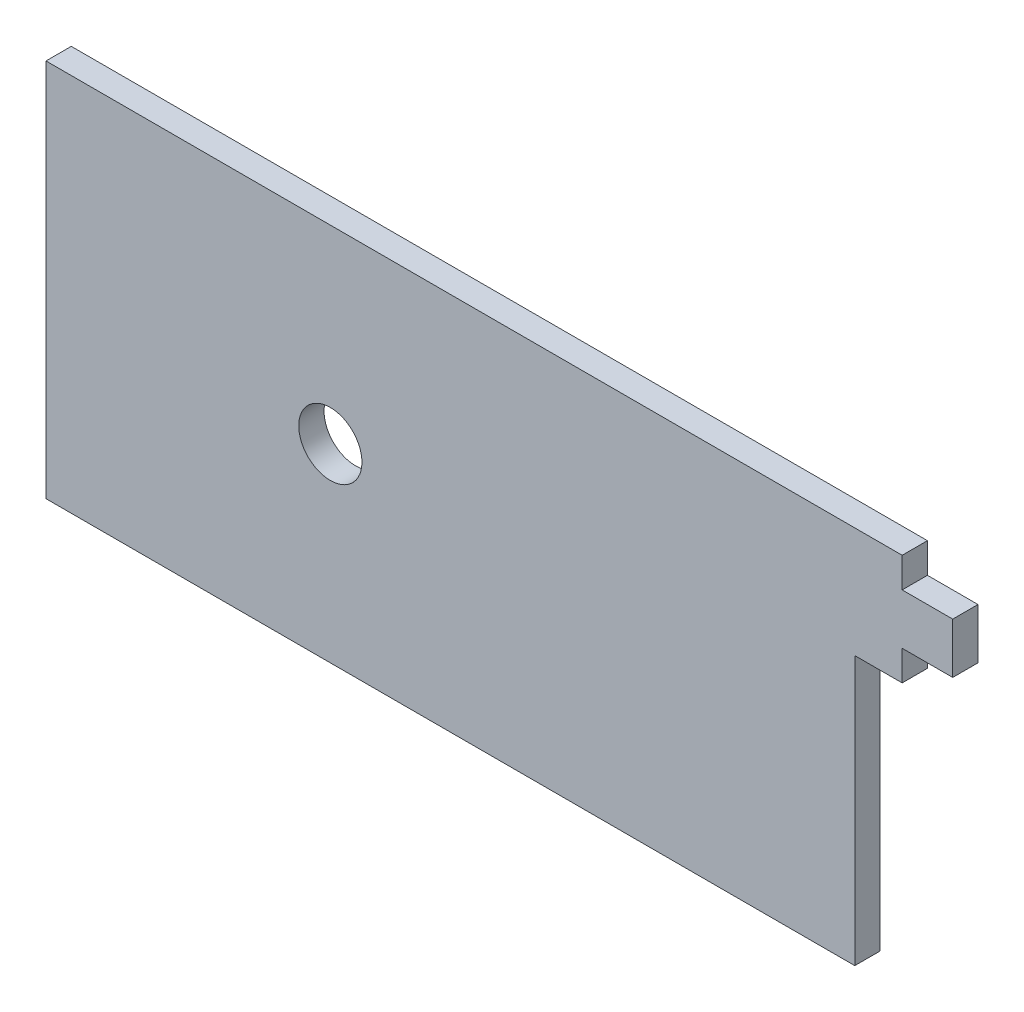
ISO-10303-21;
HEADER;
FILE_DESCRIPTION(('STEP AP214'),'2;1');
FILE_NAME('part.step','',(''),(''),'','','');
FILE_SCHEMA(('AUTOMOTIVE_DESIGN { 1 0 10303 214 1 1 1 1 }'));
ENDSEC;
DATA;
#1=APPLICATION_CONTEXT('core data for automotive mechanical design processes');
#2=APPLICATION_PROTOCOL_DEFINITION('international standard','automotive_design',2000,#1);
#3=PRODUCT_CONTEXT('',#1,'mechanical');
#4=PRODUCT('Part','Part','',(#3));
#5=PRODUCT_RELATED_PRODUCT_CATEGORY('part','',(#4));
#6=PRODUCT_DEFINITION_FORMATION('','',#4);
#7=PRODUCT_DEFINITION_CONTEXT('part definition',#1,'design');
#8=PRODUCT_DEFINITION('design','',#6,#7);
#9=PRODUCT_DEFINITION_SHAPE('','',#8);
#10=(LENGTH_UNIT() NAMED_UNIT(*) SI_UNIT(.MILLI.,.METRE.));
#11=(NAMED_UNIT(*) PLANE_ANGLE_UNIT() SI_UNIT($,.RADIAN.));
#12=(NAMED_UNIT(*) SI_UNIT($,.STERADIAN.) SOLID_ANGLE_UNIT());
#13=UNCERTAINTY_MEASURE_WITH_UNIT(LENGTH_MEASURE(1.E-05),#10,'distance_accuracy_value','');
#14=(GEOMETRIC_REPRESENTATION_CONTEXT(3) GLOBAL_UNCERTAINTY_ASSIGNED_CONTEXT((#13)) GLOBAL_UNIT_ASSIGNED_CONTEXT((#10,
#11,#12)) REPRESENTATION_CONTEXT('',''));
#15=CARTESIAN_POINT('',(0.,0.,0.));
#16=DIRECTION('',(0.,0.,1.));
#17=DIRECTION('',(1.,0.,0.));
#18=AXIS2_PLACEMENT_3D('',#15,#16,#17);
#19=CARTESIAN_POINT('',(0.,0.,4.));
#20=DIRECTION('',(0.,0.,-1.));
#21=DIRECTION('',(-1.,0.,0.));
#22=AXIS2_PLACEMENT_3D('',#19,#20,#21);
#23=PLANE('',#22);
#24=DIRECTION('',(-1.,0.,0.));
#25=VECTOR('',#24,1.);
#26=CARTESIAN_POINT('',(-81.,30.,4.));
#27=LINE('',#26,#25);
#28=CARTESIAN_POINT('',(54.5,30.,4.));
#29=VERTEX_POINT('',#28);
#30=CARTESIAN_POINT('',(-81.,30.,4.));
#31=VERTEX_POINT('',#30);
#32=EDGE_CURVE('E50',#29,#31,#27,.T.);
#33=ORIENTED_EDGE('',*,*,#32,.T.);
#34=DIRECTION('',(0.,-1.,0.));
#35=VECTOR('',#34,1.);
#36=CARTESIAN_POINT('',(-81.,-30.,4.));
#37=LINE('',#36,#35);
#38=CARTESIAN_POINT('',(-81.,-30.,4.));
#39=VERTEX_POINT('',#38);
#40=EDGE_CURVE('E100',#31,#39,#37,.T.);
#41=ORIENTED_EDGE('',*,*,#40,.T.);
#42=DIRECTION('',(1.,0.,0.));
#43=VECTOR('',#42,1.);
#44=CARTESIAN_POINT('',(-81.,-30.,4.));
#45=LINE('',#44,#43);
#46=CARTESIAN_POINT('',(47.,-30.,4.));
#47=VERTEX_POINT('',#46);
#48=EDGE_CURVE('E184',#39,#47,#45,.T.);
#49=ORIENTED_EDGE('',*,*,#48,.T.);
#50=DIRECTION('',(0.,1.,0.));
#51=VECTOR('',#50,1.);
#52=CARTESIAN_POINT('',(47.,12.5,4.));
#53=LINE('',#52,#51);
#54=CARTESIAN_POINT('',(47.,12.5,4.));
#55=VERTEX_POINT('',#54);
#56=EDGE_CURVE('E204',#47,#55,#53,.T.);
#57=ORIENTED_EDGE('',*,*,#56,.T.);
#58=DIRECTION('',(1.,0.,0.));
#59=VECTOR('',#58,1.);
#60=CARTESIAN_POINT('',(54.5,12.5,4.));
#61=LINE('',#60,#59);
#62=CARTESIAN_POINT('',(54.5,12.5,4.));
#63=VERTEX_POINT('',#62);
#64=EDGE_CURVE('E201',#55,#63,#61,.T.);
#65=ORIENTED_EDGE('',*,*,#64,.T.);
#66=DIRECTION('',(0.,1.,0.));
#67=VECTOR('',#66,1.);
#68=CARTESIAN_POINT('',(54.5,17.25,4.));
#69=LINE('',#68,#67);
#70=CARTESIAN_POINT('',(54.5,17.25,4.));
#71=VERTEX_POINT('',#70);
#72=EDGE_CURVE('E203',#63,#71,#69,.T.);
#73=ORIENTED_EDGE('',*,*,#72,.T.);
#74=DIRECTION('',(1.,0.,0.));
#75=VECTOR('',#74,1.);
#76=CARTESIAN_POINT('',(62.5,17.25,4.));
#77=LINE('',#76,#75);
#78=CARTESIAN_POINT('',(62.5,17.25,4.));
#79=VERTEX_POINT('',#78);
#80=EDGE_CURVE('E126',#71,#79,#77,.T.);
#81=ORIENTED_EDGE('',*,*,#80,.T.);
#82=DIRECTION('',(0.,1.,0.));
#83=VECTOR('',#82,1.);
#84=CARTESIAN_POINT('',(62.5,25.25,4.));
#85=LINE('',#84,#83);
#86=CARTESIAN_POINT('',(62.5,25.25,4.));
#87=VERTEX_POINT('',#86);
#88=EDGE_CURVE('E120',#79,#87,#85,.T.);
#89=ORIENTED_EDGE('',*,*,#88,.T.);
#90=DIRECTION('',(-1.,0.,0.));
#91=VECTOR('',#90,1.);
#92=CARTESIAN_POINT('',(54.5,25.25,4.));
#93=LINE('',#92,#91);
#94=CARTESIAN_POINT('',(54.5,25.25,4.));
#95=VERTEX_POINT('',#94);
#96=EDGE_CURVE('E124',#87,#95,#93,.T.);
#97=ORIENTED_EDGE('',*,*,#96,.T.);
#98=DIRECTION('',(0.,1.,0.));
#99=VECTOR('',#98,1.);
#100=CARTESIAN_POINT('',(54.5,30.,4.));
#101=LINE('',#100,#99);
#102=EDGE_CURVE('E140',#95,#29,#101,.T.);
#103=ORIENTED_EDGE('',*,*,#102,.T.);
#104=EDGE_LOOP('',(#33,#41,#49,#57,#65,#73,#81,#89,#97,#103));
#105=FACE_BOUND('',#104,.T.);
#106=CARTESIAN_POINT('',(-36.,0.,4.));
#107=DIRECTION('',(0.,0.,1.));
#108=DIRECTION('',(1.,0.,0.));
#109=AXIS2_PLACEMENT_3D('',#106,#107,#108);
#110=CIRCLE('',#109,5.);
#111=CARTESIAN_POINT('',(-31.,0.,4.));
#112=VERTEX_POINT('',#111);
#113=EDGE_CURVE('E149',#112,#112,#110,.T.);
#114=ORIENTED_EDGE('',*,*,#113,.F.);
#115=EDGE_LOOP('',(#114));
#116=FACE_BOUND('',#115,.T.);
#117=ADVANCED_FACE('F33',(#105,#116),#23,.F.);
#118=CARTESIAN_POINT('',(0.,0.,0.));
#119=DIRECTION('',(0.,0.,-1.));
#120=DIRECTION('',(-1.,0.,0.));
#121=AXIS2_PLACEMENT_3D('',#118,#119,#120);
#122=PLANE('',#121);
#123=DIRECTION('',(0.,-1.,0.));
#124=VECTOR('',#123,1.);
#125=CARTESIAN_POINT('',(-81.,-30.,0.));
#126=LINE('',#125,#124);
#127=CARTESIAN_POINT('',(-81.,30.,0.));
#128=VERTEX_POINT('',#127);
#129=CARTESIAN_POINT('',(-81.,-30.,0.));
#130=VERTEX_POINT('',#129);
#131=EDGE_CURVE('E146',#128,#130,#126,.T.);
#132=ORIENTED_EDGE('',*,*,#131,.F.);
#133=DIRECTION('',(-1.,0.,0.));
#134=VECTOR('',#133,1.);
#135=CARTESIAN_POINT('',(47.,30.,0.));
#136=LINE('',#135,#134);
#137=CARTESIAN_POINT('',(54.5,30.,0.));
#138=VERTEX_POINT('',#137);
#139=EDGE_CURVE('E162',#138,#128,#136,.T.);
#140=ORIENTED_EDGE('',*,*,#139,.F.);
#141=DIRECTION('',(0.,1.,0.));
#142=VECTOR('',#141,1.);
#143=CARTESIAN_POINT('',(54.5,30.,0.));
#144=LINE('',#143,#142);
#145=CARTESIAN_POINT('',(54.5,25.25,0.));
#146=VERTEX_POINT('',#145);
#147=EDGE_CURVE('E93',#146,#138,#144,.T.);
#148=ORIENTED_EDGE('',*,*,#147,.F.);
#149=DIRECTION('',(-1.,0.,0.));
#150=VECTOR('',#149,1.);
#151=CARTESIAN_POINT('',(54.5,25.25,0.));
#152=LINE('',#151,#150);
#153=CARTESIAN_POINT('',(62.5,25.25,0.));
#154=VERTEX_POINT('',#153);
#155=EDGE_CURVE('E86',#154,#146,#152,.T.);
#156=ORIENTED_EDGE('',*,*,#155,.F.);
#157=DIRECTION('',(0.,1.,0.));
#158=VECTOR('',#157,1.);
#159=CARTESIAN_POINT('',(62.5,25.25,0.));
#160=LINE('',#159,#158);
#161=CARTESIAN_POINT('',(62.5,17.25,0.));
#162=VERTEX_POINT('',#161);
#163=EDGE_CURVE('E134',#162,#154,#160,.T.);
#164=ORIENTED_EDGE('',*,*,#163,.F.);
#165=DIRECTION('',(1.,0.,0.));
#166=VECTOR('',#165,1.);
#167=CARTESIAN_POINT('',(62.5,17.25,0.));
#168=LINE('',#167,#166);
#169=CARTESIAN_POINT('',(54.5,17.25,0.));
#170=VERTEX_POINT('',#169);
#171=EDGE_CURVE('E157',#170,#162,#168,.T.);
#172=ORIENTED_EDGE('',*,*,#171,.F.);
#173=DIRECTION('',(0.,1.,0.));
#174=VECTOR('',#173,1.);
#175=CARTESIAN_POINT('',(54.5,17.25,0.));
#176=LINE('',#175,#174);
#177=CARTESIAN_POINT('',(54.5,12.5,0.));
#178=VERTEX_POINT('',#177);
#179=EDGE_CURVE('E155',#178,#170,#176,.T.);
#180=ORIENTED_EDGE('',*,*,#179,.F.);
#181=DIRECTION('',(1.,0.,0.));
#182=VECTOR('',#181,1.);
#183=CARTESIAN_POINT('',(54.5,12.5,0.));
#184=LINE('',#183,#182);
#185=CARTESIAN_POINT('',(47.,12.5,0.));
#186=VERTEX_POINT('',#185);
#187=EDGE_CURVE('E153',#186,#178,#184,.T.);
#188=ORIENTED_EDGE('',*,*,#187,.F.);
#189=DIRECTION('',(0.,1.,0.));
#190=VECTOR('',#189,1.);
#191=CARTESIAN_POINT('',(47.,12.5,0.));
#192=LINE('',#191,#190);
#193=CARTESIAN_POINT('',(47.,-30.,0.));
#194=VERTEX_POINT('',#193);
#195=EDGE_CURVE('E151',#194,#186,#192,.T.);
#196=ORIENTED_EDGE('',*,*,#195,.F.);
#197=DIRECTION('',(1.,0.,0.));
#198=VECTOR('',#197,1.);
#199=CARTESIAN_POINT('',(-81.,-30.,0.));
#200=LINE('',#199,#198);
#201=EDGE_CURVE('E148',#130,#194,#200,.T.);
#202=ORIENTED_EDGE('',*,*,#201,.F.);
#203=EDGE_LOOP('',(#132,#140,#148,#156,#164,#172,#180,#188,#196,#202));
#204=FACE_BOUND('',#203,.T.);
#205=CARTESIAN_POINT('',(-36.,0.,0.));
#206=DIRECTION('',(0.,0.,1.));
#207=DIRECTION('',(1.,0.,0.));
#208=AXIS2_PLACEMENT_3D('',#205,#206,#207);
#209=CIRCLE('',#208,5.);
#210=CARTESIAN_POINT('',(-31.,0.,0.));
#211=VERTEX_POINT('',#210);
#212=EDGE_CURVE('E212',#211,#211,#209,.T.);
#213=ORIENTED_EDGE('',*,*,#212,.T.);
#214=EDGE_LOOP('',(#213));
#215=FACE_BOUND('',#214,.T.);
#216=ADVANCED_FACE('F188',(#204,#215),#122,.T.);
#217=CARTESIAN_POINT('',(-81.,-30.,4.));
#218=DIRECTION('',(1.,0.,0.));
#219=DIRECTION('',(0.,0.,-1.));
#220=AXIS2_PLACEMENT_3D('',#217,#218,#219);
#221=PLANE('',#220);
#222=ORIENTED_EDGE('',*,*,#131,.T.);
#223=DIRECTION('',(0.,0.,-1.));
#224=VECTOR('',#223,1.);
#225=CARTESIAN_POINT('',(-81.,-30.,4.));
#226=LINE('',#225,#224);
#227=EDGE_CURVE('E42',#39,#130,#226,.T.);
#228=ORIENTED_EDGE('',*,*,#227,.F.);
#229=ORIENTED_EDGE('',*,*,#40,.F.);
#230=DIRECTION('',(0.,0.,-1.));
#231=VECTOR('',#230,1.);
#232=CARTESIAN_POINT('',(-81.,30.,4.));
#233=LINE('',#232,#231);
#234=EDGE_CURVE('E11',#31,#128,#233,.T.);
#235=ORIENTED_EDGE('',*,*,#234,.T.);
#236=EDGE_LOOP('',(#222,#228,#229,#235));
#237=FACE_BOUND('',#236,.T.);
#238=ADVANCED_FACE('F35',(#237),#221,.F.);
#239=CARTESIAN_POINT('',(-81.,-30.,4.));
#240=DIRECTION('',(0.,1.,0.));
#241=DIRECTION('',(0.,0.,1.));
#242=AXIS2_PLACEMENT_3D('',#239,#240,#241);
#243=PLANE('',#242);
#244=ORIENTED_EDGE('',*,*,#201,.T.);
#245=DIRECTION('',(0.,0.,-1.));
#246=VECTOR('',#245,1.);
#247=CARTESIAN_POINT('',(47.,-30.,4.));
#248=LINE('',#247,#246);
#249=EDGE_CURVE('E176',#47,#194,#248,.T.);
#250=ORIENTED_EDGE('',*,*,#249,.F.);
#251=ORIENTED_EDGE('',*,*,#48,.F.);
#252=ORIENTED_EDGE('',*,*,#227,.T.);
#253=EDGE_LOOP('',(#244,#250,#251,#252));
#254=FACE_BOUND('',#253,.T.);
#255=ADVANCED_FACE('F182',(#254),#243,.F.);
#256=CARTESIAN_POINT('',(47.,12.5,4.));
#257=DIRECTION('',(-1.,0.,0.));
#258=DIRECTION('',(0.,0.,1.));
#259=AXIS2_PLACEMENT_3D('',#256,#257,#258);
#260=PLANE('',#259);
#261=ORIENTED_EDGE('',*,*,#195,.T.);
#262=DIRECTION('',(0.,0.,-1.));
#263=VECTOR('',#262,1.);
#264=CARTESIAN_POINT('',(47.,12.5,4.));
#265=LINE('',#264,#263);
#266=EDGE_CURVE('E173',#55,#186,#265,.T.);
#267=ORIENTED_EDGE('',*,*,#266,.F.);
#268=ORIENTED_EDGE('',*,*,#56,.F.);
#269=ORIENTED_EDGE('',*,*,#249,.T.);
#270=EDGE_LOOP('',(#261,#267,#268,#269));
#271=FACE_BOUND('',#270,.T.);
#272=ADVANCED_FACE('F195',(#271),#260,.F.);
#273=CARTESIAN_POINT('',(54.5,12.5,4.));
#274=DIRECTION('',(0.,1.,0.));
#275=DIRECTION('',(0.,0.,1.));
#276=AXIS2_PLACEMENT_3D('',#273,#274,#275);
#277=PLANE('',#276);
#278=ORIENTED_EDGE('',*,*,#187,.T.);
#279=DIRECTION('',(0.,0.,-1.));
#280=VECTOR('',#279,1.);
#281=CARTESIAN_POINT('',(54.5,12.5,4.));
#282=LINE('',#281,#280);
#283=EDGE_CURVE('E170',#63,#178,#282,.T.);
#284=ORIENTED_EDGE('',*,*,#283,.F.);
#285=ORIENTED_EDGE('',*,*,#64,.F.);
#286=ORIENTED_EDGE('',*,*,#266,.T.);
#287=EDGE_LOOP('',(#278,#284,#285,#286));
#288=FACE_BOUND('',#287,.T.);
#289=ADVANCED_FACE('F199',(#288),#277,.F.);
#290=CARTESIAN_POINT('',(54.5,17.25,4.));
#291=DIRECTION('',(-1.,0.,0.));
#292=DIRECTION('',(0.,0.,1.));
#293=AXIS2_PLACEMENT_3D('',#290,#291,#292);
#294=PLANE('',#293);
#295=ORIENTED_EDGE('',*,*,#179,.T.);
#296=DIRECTION('',(0.,0.,-1.));
#297=VECTOR('',#296,1.);
#298=CARTESIAN_POINT('',(54.5,17.25,4.));
#299=LINE('',#298,#297);
#300=EDGE_CURVE('E167',#71,#170,#299,.T.);
#301=ORIENTED_EDGE('',*,*,#300,.F.);
#302=ORIENTED_EDGE('',*,*,#72,.F.);
#303=ORIENTED_EDGE('',*,*,#283,.T.);
#304=EDGE_LOOP('',(#295,#301,#302,#303));
#305=FACE_BOUND('',#304,.T.);
#306=ADVANCED_FACE('F241',(#305),#294,.F.);
#307=CARTESIAN_POINT('',(62.5,17.25,4.));
#308=DIRECTION('',(0.,1.,0.));
#309=DIRECTION('',(0.,0.,1.));
#310=AXIS2_PLACEMENT_3D('',#307,#308,#309);
#311=PLANE('',#310);
#312=ORIENTED_EDGE('',*,*,#171,.T.);
#313=DIRECTION('',(0.,0.,-1.));
#314=VECTOR('',#313,1.);
#315=CARTESIAN_POINT('',(62.5,17.25,4.));
#316=LINE('',#315,#314);
#317=EDGE_CURVE('E135',#79,#162,#316,.T.);
#318=ORIENTED_EDGE('',*,*,#317,.F.);
#319=ORIENTED_EDGE('',*,*,#80,.F.);
#320=ORIENTED_EDGE('',*,*,#300,.T.);
#321=EDGE_LOOP('',(#312,#318,#319,#320));
#322=FACE_BOUND('',#321,.T.);
#323=ADVANCED_FACE('F238',(#322),#311,.F.);
#324=CARTESIAN_POINT('',(62.5,25.25,4.));
#325=DIRECTION('',(-1.,0.,0.));
#326=DIRECTION('',(0.,0.,1.));
#327=AXIS2_PLACEMENT_3D('',#324,#325,#326);
#328=PLANE('',#327);
#329=ORIENTED_EDGE('',*,*,#163,.T.);
#330=DIRECTION('',(0.,0.,-1.));
#331=VECTOR('',#330,1.);
#332=CARTESIAN_POINT('',(62.5,25.25,4.));
#333=LINE('',#332,#331);
#334=EDGE_CURVE('E131',#87,#154,#333,.T.);
#335=ORIENTED_EDGE('',*,*,#334,.F.);
#336=ORIENTED_EDGE('',*,*,#88,.F.);
#337=ORIENTED_EDGE('',*,*,#317,.T.);
#338=EDGE_LOOP('',(#329,#335,#336,#337));
#339=FACE_BOUND('',#338,.T.);
#340=ADVANCED_FACE('F132',(#339),#328,.F.);
#341=CARTESIAN_POINT('',(54.5,25.25,4.));
#342=DIRECTION('',(0.,-1.,0.));
#343=DIRECTION('',(0.,0.,-1.));
#344=AXIS2_PLACEMENT_3D('',#341,#342,#343);
#345=PLANE('',#344);
#346=ORIENTED_EDGE('',*,*,#155,.T.);
#347=DIRECTION('',(0.,0.,-1.));
#348=VECTOR('',#347,1.);
#349=CARTESIAN_POINT('',(54.5,25.25,4.));
#350=LINE('',#349,#348);
#351=EDGE_CURVE('E136',#95,#146,#350,.T.);
#352=ORIENTED_EDGE('',*,*,#351,.F.);
#353=ORIENTED_EDGE('',*,*,#96,.F.);
#354=ORIENTED_EDGE('',*,*,#334,.T.);
#355=EDGE_LOOP('',(#346,#352,#353,#354));
#356=FACE_BOUND('',#355,.T.);
#357=ADVANCED_FACE('F138',(#356),#345,.F.);
#358=CARTESIAN_POINT('',(54.5,30.,4.));
#359=DIRECTION('',(-1.,0.,0.));
#360=DIRECTION('',(0.,-1.,0.));
#361=AXIS2_PLACEMENT_3D('',#358,#359,#360);
#362=PLANE('',#361);
#363=ORIENTED_EDGE('',*,*,#147,.T.);
#364=DIRECTION('',(0.,0.,-1.));
#365=VECTOR('',#364,1.);
#366=CARTESIAN_POINT('',(54.5,30.,4.));
#367=LINE('',#366,#365);
#368=EDGE_CURVE('E142',#29,#138,#367,.T.);
#369=ORIENTED_EDGE('',*,*,#368,.F.);
#370=ORIENTED_EDGE('',*,*,#102,.F.);
#371=ORIENTED_EDGE('',*,*,#351,.T.);
#372=EDGE_LOOP('',(#363,#369,#370,#371));
#373=FACE_BOUND('',#372,.T.);
#374=ADVANCED_FACE('F231',(#373),#362,.F.);
#375=CARTESIAN_POINT('',(47.,30.,4.));
#376=DIRECTION('',(0.,-1.,0.));
#377=DIRECTION('',(0.,0.,-1.));
#378=AXIS2_PLACEMENT_3D('',#375,#376,#377);
#379=PLANE('',#378);
#380=ORIENTED_EDGE('',*,*,#139,.T.);
#381=ORIENTED_EDGE('',*,*,#234,.F.);
#382=ORIENTED_EDGE('',*,*,#32,.F.);
#383=ORIENTED_EDGE('',*,*,#368,.T.);
#384=EDGE_LOOP('',(#380,#381,#382,#383));
#385=FACE_BOUND('',#384,.T.);
#386=ADVANCED_FACE('F228',(#385),#379,.F.);
#387=CARTESIAN_POINT('',(-36.,0.,4.));
#388=DIRECTION('',(0.,0.,-1.));
#389=DIRECTION('',(-1.,0.,0.));
#390=AXIS2_PLACEMENT_3D('',#387,#388,#389);
#391=CYLINDRICAL_SURFACE('',#390,5.);
#392=ORIENTED_EDGE('',*,*,#113,.T.);
#393=EDGE_LOOP('',(#392));
#394=FACE_BOUND('',#393,.T.);
#395=ORIENTED_EDGE('',*,*,#212,.F.);
#396=EDGE_LOOP('',(#395));
#397=FACE_BOUND('',#396,.T.);
#398=ADVANCED_FACE('F218',(#394,#397),#391,.F.);
#399=CLOSED_SHELL('',(#117,#216,#238,#255,#272,#289,#306,#323,#340,#357,#374,#386,#398));
#400=MANIFOLD_SOLID_BREP('B2',#399);
#401=ADVANCED_BREP_SHAPE_REPRESENTATION('',(#18,#400),#14);
#402=SHAPE_DEFINITION_REPRESENTATION(#9,#401);
ENDSEC;
END-ISO-10303-21;
